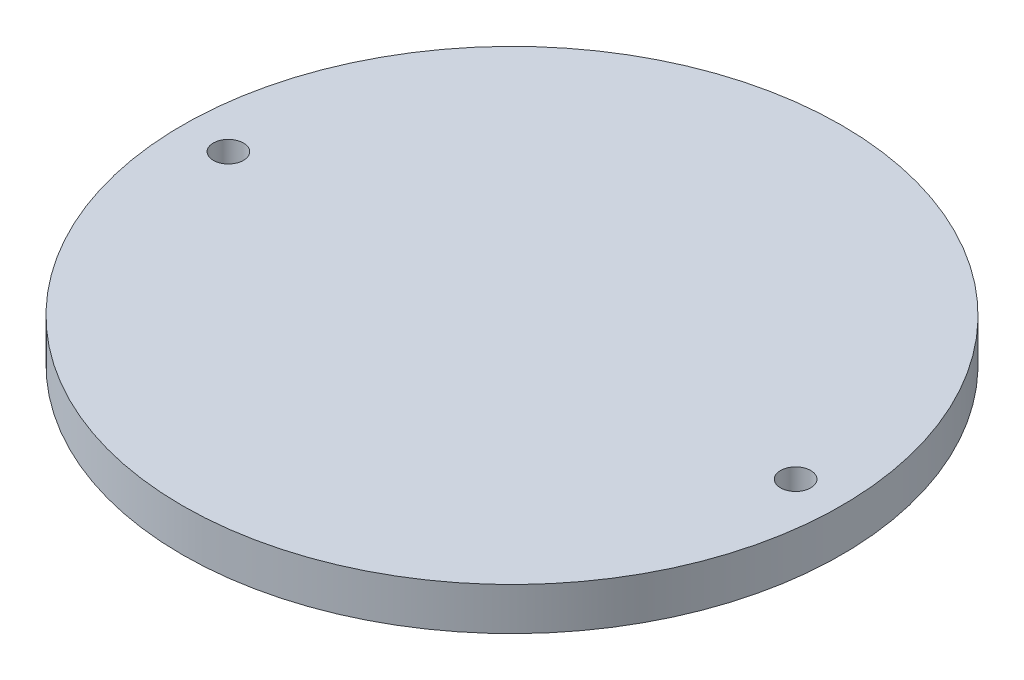
ISO-10303-21;
HEADER;
FILE_DESCRIPTION(('STEP AP214'),'2;1');
FILE_NAME('part.step','',(''),(''),'','','');
FILE_SCHEMA(('AUTOMOTIVE_DESIGN { 1 0 10303 214 1 1 1 1 }'));
ENDSEC;
DATA;
#1=APPLICATION_CONTEXT('core data for automotive mechanical design processes');
#2=APPLICATION_PROTOCOL_DEFINITION('international standard','automotive_design',2000,#1);
#3=PRODUCT_CONTEXT('',#1,'mechanical');
#4=PRODUCT('Part','Part','',(#3));
#5=PRODUCT_RELATED_PRODUCT_CATEGORY('part','',(#4));
#6=PRODUCT_DEFINITION_FORMATION('','',#4);
#7=PRODUCT_DEFINITION_CONTEXT('part definition',#1,'design');
#8=PRODUCT_DEFINITION('design','',#6,#7);
#9=PRODUCT_DEFINITION_SHAPE('','',#8);
#10=(LENGTH_UNIT() NAMED_UNIT(*) SI_UNIT(.MILLI.,.METRE.));
#11=(NAMED_UNIT(*) PLANE_ANGLE_UNIT() SI_UNIT($,.RADIAN.));
#12=(NAMED_UNIT(*) SI_UNIT($,.STERADIAN.) SOLID_ANGLE_UNIT());
#13=UNCERTAINTY_MEASURE_WITH_UNIT(LENGTH_MEASURE(1.E-05),#10,'distance_accuracy_value','');
#14=(GEOMETRIC_REPRESENTATION_CONTEXT(3) GLOBAL_UNCERTAINTY_ASSIGNED_CONTEXT((#13)) GLOBAL_UNIT_ASSIGNED_CONTEXT((#10,
#11,#12)) REPRESENTATION_CONTEXT('',''));
#15=CARTESIAN_POINT('',(0.,0.,0.));
#16=DIRECTION('',(0.,0.,1.));
#17=DIRECTION('',(1.,0.,0.));
#18=AXIS2_PLACEMENT_3D('',#15,#16,#17);
#19=CARTESIAN_POINT('',(0.,9.525,0.));
#20=DIRECTION('',(0.,-1.,0.));
#21=DIRECTION('',(0.,0.,-1.));
#22=AXIS2_PLACEMENT_3D('',#19,#20,#21);
#23=CYLINDRICAL_SURFACE('',#22,73.787);
#24=CARTESIAN_POINT('',(0.,9.525,0.));
#25=DIRECTION('',(0.,1.,0.));
#26=DIRECTION('',(0.,0.,1.));
#27=AXIS2_PLACEMENT_3D('',#24,#25,#26);
#28=CIRCLE('',#27,73.787);
#29=CARTESIAN_POINT('',(0.,9.525,-73.787));
#30=VERTEX_POINT('',#29);
#31=EDGE_CURVE('E10',#30,#30,#28,.T.);
#32=CARTESIAN_POINT('',(0.,0.,0.));
#33=DIRECTION('',(0.,1.,0.));
#34=DIRECTION('',(0.,0.,1.));
#35=AXIS2_PLACEMENT_3D('',#32,#33,#34);
#36=CIRCLE('',#35,73.787);
#37=CARTESIAN_POINT('',(0.,0.,-73.787));
#38=VERTEX_POINT('',#37);
#39=EDGE_CURVE('E46',#38,#38,#36,.T.);
#40=CARTESIAN_POINT('',(0.,9.525,-73.787));
#41=CARTESIAN_POINT('',(0.,9.42578125,-73.787));
#42=CARTESIAN_POINT('',(0.,9.3265625,-73.787));
#43=CARTESIAN_POINT('',(0.,9.128125,-73.787));
#44=CARTESIAN_POINT('',(0.,9.02890625,-73.787));
#45=CARTESIAN_POINT('',(0.,8.83046875,-73.787));
#46=CARTESIAN_POINT('',(0.,8.73125,-73.787));
#47=CARTESIAN_POINT('',(0.,8.5328125,-73.787));
#48=CARTESIAN_POINT('',(0.,8.43359375,-73.787));
#49=CARTESIAN_POINT('',(0.,8.23515625,-73.787));
#50=CARTESIAN_POINT('',(0.,8.1359375,-73.787));
#51=CARTESIAN_POINT('',(0.,7.9375,-73.787));
#52=CARTESIAN_POINT('',(0.,7.83828125,-73.787));
#53=CARTESIAN_POINT('',(0.,7.63984375,-73.787));
#54=CARTESIAN_POINT('',(0.,7.540625,-73.787));
#55=CARTESIAN_POINT('',(0.,7.3421875,-73.787));
#56=CARTESIAN_POINT('',(0.,7.24296875,-73.787));
#57=CARTESIAN_POINT('',(0.,7.04453125,-73.787));
#58=CARTESIAN_POINT('',(0.,6.9453125,-73.787));
#59=CARTESIAN_POINT('',(0.,6.746875,-73.787));
#60=CARTESIAN_POINT('',(0.,6.64765625,-73.787));
#61=CARTESIAN_POINT('',(0.,6.44921875,-73.787));
#62=CARTESIAN_POINT('',(0.,6.35,-73.787));
#63=CARTESIAN_POINT('',(0.,6.1515625,-73.787));
#64=CARTESIAN_POINT('',(0.,6.05234375,-73.787));
#65=CARTESIAN_POINT('',(0.,5.85390625,-73.787));
#66=CARTESIAN_POINT('',(0.,5.7546875,-73.787));
#67=CARTESIAN_POINT('',(0.,5.55625,-73.787));
#68=CARTESIAN_POINT('',(0.,5.45703125,-73.787));
#69=CARTESIAN_POINT('',(0.,5.25859375,-73.787));
#70=CARTESIAN_POINT('',(0.,5.159375,-73.787));
#71=CARTESIAN_POINT('',(0.,4.9609375,-73.787));
#72=CARTESIAN_POINT('',(0.,4.86171875,-73.787));
#73=CARTESIAN_POINT('',(0.,4.66328125,-73.787));
#74=CARTESIAN_POINT('',(0.,4.5640625,-73.787));
#75=CARTESIAN_POINT('',(0.,4.365625,-73.787));
#76=CARTESIAN_POINT('',(0.,4.26640625,-73.787));
#77=CARTESIAN_POINT('',(0.,4.06796875,-73.787));
#78=CARTESIAN_POINT('',(0.,3.96875,-73.787));
#79=CARTESIAN_POINT('',(0.,3.7703125,-73.787));
#80=CARTESIAN_POINT('',(0.,3.67109375,-73.787));
#81=CARTESIAN_POINT('',(0.,3.47265625,-73.787));
#82=CARTESIAN_POINT('',(0.,3.3734375,-73.787));
#83=CARTESIAN_POINT('',(0.,3.175,-73.787));
#84=CARTESIAN_POINT('',(0.,3.07578125,-73.787));
#85=CARTESIAN_POINT('',(0.,2.87734375,-73.787));
#86=CARTESIAN_POINT('',(0.,2.778125,-73.787));
#87=CARTESIAN_POINT('',(0.,2.5796875,-73.787));
#88=CARTESIAN_POINT('',(0.,2.48046875,-73.787));
#89=CARTESIAN_POINT('',(0.,2.28203125,-73.787));
#90=CARTESIAN_POINT('',(0.,2.1828125,-73.787));
#91=CARTESIAN_POINT('',(0.,1.984375,-73.787));
#92=CARTESIAN_POINT('',(0.,1.88515625,-73.787));
#93=CARTESIAN_POINT('',(0.,1.68671875,-73.787));
#94=CARTESIAN_POINT('',(0.,1.5875,-73.787));
#95=CARTESIAN_POINT('',(0.,1.3890625,-73.787));
#96=CARTESIAN_POINT('',(0.,1.28984375,-73.787));
#97=CARTESIAN_POINT('',(0.,1.09140625,-73.787));
#98=CARTESIAN_POINT('',(0.,0.992187500000001,-73.787));
#99=CARTESIAN_POINT('',(0.,0.793750000000001,-73.787));
#100=CARTESIAN_POINT('',(0.,0.69453125,-73.787));
#101=CARTESIAN_POINT('',(0.,0.49609375,-73.787));
#102=CARTESIAN_POINT('',(0.,0.396875,-73.787));
#103=CARTESIAN_POINT('',(0.,0.1984375,-73.787));
#104=CARTESIAN_POINT('',(0.,0.0992187500000001,-73.787));
#105=CARTESIAN_POINT('',(0.,0.,-73.787));
#106=B_SPLINE_CURVE_WITH_KNOTS('',3,(#40,#41,#42,#43,#44,#45,#46,#47,#48,#49,#50,#51,#52,#53,
#54,#55,#56,#57,#58,#59,#60,#61,#62,#63,#64,#65,#66,#67,#68,#69,#70,#71,#72,#73,#74,#75,#76,#77,
#78,#79,#80,#81,#82,#83,#84,#85,#86,#87,#88,#89,#90,#91,#92,#93,#94,#95,#96,#97,#98,#99,#100,
#101,#102,#103,#104,#105),.UNSPECIFIED.,.F.,.F.,(4,2,2,2,2,2,2,2,2,2,2,2,2,2,2,2,2,2,2,2,2,2,2,
2,2,2,2,2,2,2,2,2,4),(0.,0.29765625,0.5953125,0.892968750000001,1.190625,1.48828125,1.7859375,
2.08359375,2.38125,2.67890625,2.9765625,3.27421875,3.571875,3.86953125,4.1671875,4.46484375,
4.7625,5.06015625,5.3578125,5.65546875,5.953125,6.25078125,6.5484375,6.84609375,7.14375,
7.44140625,7.7390625,8.03671875,8.334375,8.63203125,8.9296875,9.22734375,9.525),.UNSPECIFIED.);
#107=EDGE_CURVE('BSEAM43',#30,#38,#106,.T.);
#108=ORIENTED_EDGE('',*,*,#31,.F.);
#109=ORIENTED_EDGE('',*,*,#39,.T.);
#110=ORIENTED_EDGE('',*,*,#107,.T.);
#111=ORIENTED_EDGE('',*,*,#107,.F.);
#112=EDGE_LOOP('',(#108,#110,#109,#111));
#113=FACE_BOUND('',#112,.T.);
#114=ADVANCED_FACE('F43',(#113),#23,.T.);
#115=CARTESIAN_POINT('',(0.,9.525,0.));
#116=DIRECTION('',(0.,1.,0.));
#117=DIRECTION('',(0.,0.,1.));
#118=AXIS2_PLACEMENT_3D('',#115,#116,#117);
#119=PLANE('',#118);
#120=CARTESIAN_POINT('',(-63.5,9.525,0.));
#121=DIRECTION('',(0.,1.,0.));
#122=DIRECTION('',(0.,0.,1.));
#123=AXIS2_PLACEMENT_3D('',#120,#121,#122);
#124=CIRCLE('',#123,3.3782);
#125=CARTESIAN_POINT('',(-63.5,9.525,3.3782));
#126=VERTEX_POINT('',#125);
#127=EDGE_CURVE('E61',#126,#126,#124,.T.);
#128=ORIENTED_EDGE('',*,*,#127,.F.);
#129=EDGE_LOOP('',(#128));
#130=FACE_BOUND('',#129,.T.);
#131=CARTESIAN_POINT('',(63.5,9.525,0.));
#132=DIRECTION('',(0.,1.,0.));
#133=DIRECTION('',(0.,0.,1.));
#134=AXIS2_PLACEMENT_3D('',#131,#132,#133);
#135=CIRCLE('',#134,3.37819999999999);
#136=CARTESIAN_POINT('',(63.5,9.525,3.37819999999997));
#137=VERTEX_POINT('',#136);
#138=EDGE_CURVE('E58',#137,#137,#135,.T.);
#139=ORIENTED_EDGE('',*,*,#138,.F.);
#140=EDGE_LOOP('',(#139));
#141=FACE_BOUND('',#140,.T.);
#142=ORIENTED_EDGE('',*,*,#31,.T.);
#143=EDGE_LOOP('',(#142));
#144=FACE_BOUND('',#143,.T.);
#145=ADVANCED_FACE('F77',(#130,#141,#144),#119,.T.);
#146=CARTESIAN_POINT('',(0.,0.,0.));
#147=DIRECTION('',(0.,1.,0.));
#148=DIRECTION('',(0.,0.,1.));
#149=AXIS2_PLACEMENT_3D('',#146,#147,#148);
#150=PLANE('',#149);
#151=CARTESIAN_POINT('',(-63.5,0.,0.));
#152=DIRECTION('',(0.,1.,0.));
#153=DIRECTION('',(0.,0.,1.));
#154=AXIS2_PLACEMENT_3D('',#151,#152,#153);
#155=CIRCLE('',#154,3.3782);
#156=CARTESIAN_POINT('',(-63.5,0.,3.3782));
#157=VERTEX_POINT('',#156);
#158=EDGE_CURVE('E53',#157,#157,#155,.T.);
#159=ORIENTED_EDGE('',*,*,#158,.T.);
#160=EDGE_LOOP('',(#159));
#161=FACE_BOUND('',#160,.T.);
#162=CARTESIAN_POINT('',(63.5,0.,0.));
#163=DIRECTION('',(0.,1.,0.));
#164=DIRECTION('',(0.,0.,1.));
#165=AXIS2_PLACEMENT_3D('',#162,#163,#164);
#166=CIRCLE('',#165,3.37819999999999);
#167=CARTESIAN_POINT('',(63.5,0.,3.37819999999997));
#168=VERTEX_POINT('',#167);
#169=EDGE_CURVE('E55',#168,#168,#166,.T.);
#170=ORIENTED_EDGE('',*,*,#169,.T.);
#171=EDGE_LOOP('',(#170));
#172=FACE_BOUND('',#171,.T.);
#173=ORIENTED_EDGE('',*,*,#39,.F.);
#174=EDGE_LOOP('',(#173));
#175=FACE_BOUND('',#174,.T.);
#176=ADVANCED_FACE('F67',(#161,#172,#175),#150,.F.);
#177=CARTESIAN_POINT('',(63.5,0.,0.));
#178=DIRECTION('',(0.,1.,0.));
#179=DIRECTION('',(0.,0.,1.));
#180=AXIS2_PLACEMENT_3D('',#177,#178,#179);
#181=CYLINDRICAL_SURFACE('',#180,3.37819999999999);
#182=CARTESIAN_POINT('',(63.5,0.,3.37819999999997));
#183=CARTESIAN_POINT('',(63.5,0.0992187499999999,3.37819999999997));
#184=CARTESIAN_POINT('',(63.5,0.1984375,3.37819999999997));
#185=CARTESIAN_POINT('',(63.5,0.396875,3.37819999999997));
#186=CARTESIAN_POINT('',(63.5,0.49609375,3.37819999999997));
#187=CARTESIAN_POINT('',(63.5,0.69453125,3.37819999999997));
#188=CARTESIAN_POINT('',(63.5,0.79375,3.37819999999997));
#189=CARTESIAN_POINT('',(63.5,0.9921875,3.37819999999997));
#190=CARTESIAN_POINT('',(63.5,1.09140625,3.37819999999997));
#191=CARTESIAN_POINT('',(63.5,1.28984375,3.37819999999997));
#192=CARTESIAN_POINT('',(63.5,1.3890625,3.37819999999997));
#193=CARTESIAN_POINT('',(63.5,1.5875,3.37819999999997));
#194=CARTESIAN_POINT('',(63.5,1.68671875,3.37819999999997));
#195=CARTESIAN_POINT('',(63.5,1.88515625,3.37819999999997));
#196=CARTESIAN_POINT('',(63.5,1.984375,3.37819999999997));
#197=CARTESIAN_POINT('',(63.5,2.1828125,3.37819999999997));
#198=CARTESIAN_POINT('',(63.5,2.28203125,3.37819999999997));
#199=CARTESIAN_POINT('',(63.5,2.48046875,3.37819999999997));
#200=CARTESIAN_POINT('',(63.5,2.5796875,3.37819999999997));
#201=CARTESIAN_POINT('',(63.5,2.778125,3.37819999999997));
#202=CARTESIAN_POINT('',(63.5,2.87734375,3.37819999999997));
#203=CARTESIAN_POINT('',(63.5,3.07578125,3.37819999999997));
#204=CARTESIAN_POINT('',(63.5,3.175,3.37819999999997));
#205=CARTESIAN_POINT('',(63.5,3.3734375,3.37819999999997));
#206=CARTESIAN_POINT('',(63.5,3.47265625,3.37819999999997));
#207=CARTESIAN_POINT('',(63.5,3.67109375,3.37819999999997));
#208=CARTESIAN_POINT('',(63.5,3.7703125,3.37819999999997));
#209=CARTESIAN_POINT('',(63.5,3.96875,3.37819999999997));
#210=CARTESIAN_POINT('',(63.5,4.06796875,3.37819999999997));
#211=CARTESIAN_POINT('',(63.5,4.26640625,3.37819999999997));
#212=CARTESIAN_POINT('',(63.5,4.365625,3.37819999999997));
#213=CARTESIAN_POINT('',(63.5,4.5640625,3.37819999999997));
#214=CARTESIAN_POINT('',(63.5,4.66328125,3.37819999999997));
#215=CARTESIAN_POINT('',(63.5,4.86171875,3.37819999999997));
#216=CARTESIAN_POINT('',(63.5,4.9609375,3.37819999999997));
#217=CARTESIAN_POINT('',(63.5,5.159375,3.37819999999997));
#218=CARTESIAN_POINT('',(63.5,5.25859375,3.37819999999997));
#219=CARTESIAN_POINT('',(63.5,5.45703125,3.37819999999997));
#220=CARTESIAN_POINT('',(63.5,5.55625,3.37819999999997));
#221=CARTESIAN_POINT('',(63.5,5.7546875,3.37819999999997));
#222=CARTESIAN_POINT('',(63.5,5.85390625,3.37819999999997));
#223=CARTESIAN_POINT('',(63.5,6.05234375,3.37819999999997));
#224=CARTESIAN_POINT('',(63.5,6.1515625,3.37819999999997));
#225=CARTESIAN_POINT('',(63.5,6.35,3.37819999999997));
#226=CARTESIAN_POINT('',(63.5,6.44921875,3.37819999999997));
#227=CARTESIAN_POINT('',(63.5,6.64765625,3.37819999999997));
#228=CARTESIAN_POINT('',(63.5,6.746875,3.37819999999997));
#229=CARTESIAN_POINT('',(63.5,6.9453125,3.37819999999997));
#230=CARTESIAN_POINT('',(63.5,7.04453125,3.37819999999997));
#231=CARTESIAN_POINT('',(63.5,7.24296875,3.37819999999997));
#232=CARTESIAN_POINT('',(63.5,7.3421875,3.37819999999997));
#233=CARTESIAN_POINT('',(63.5,7.540625,3.37819999999997));
#234=CARTESIAN_POINT('',(63.5,7.63984375,3.37819999999997));
#235=CARTESIAN_POINT('',(63.5,7.83828125,3.37819999999997));
#236=CARTESIAN_POINT('',(63.5,7.9375,3.37819999999997));
#237=CARTESIAN_POINT('',(63.5,8.1359375,3.37819999999997));
#238=CARTESIAN_POINT('',(63.5,8.23515625,3.37819999999997));
#239=CARTESIAN_POINT('',(63.5,8.43359375,3.37819999999997));
#240=CARTESIAN_POINT('',(63.5,8.5328125,3.37819999999997));
#241=CARTESIAN_POINT('',(63.5,8.73125,3.37819999999997));
#242=CARTESIAN_POINT('',(63.5,8.83046875,3.37819999999997));
#243=CARTESIAN_POINT('',(63.5,9.02890625,3.37819999999997));
#244=CARTESIAN_POINT('',(63.5,9.128125,3.37819999999997));
#245=CARTESIAN_POINT('',(63.5,9.3265625,3.37819999999997));
#246=CARTESIAN_POINT('',(63.5,9.42578125,3.37819999999997));
#247=CARTESIAN_POINT('',(63.5,9.525,3.37819999999997));
#248=B_SPLINE_CURVE_WITH_KNOTS('',3,(#182,#183,#184,#185,#186,#187,#188,#189,#190,#191,#192,
#193,#194,#195,#196,#197,#198,#199,#200,#201,#202,#203,#204,#205,#206,#207,#208,#209,#210,#211,
#212,#213,#214,#215,#216,#217,#218,#219,#220,#221,#222,#223,#224,#225,#226,#227,#228,#229,#230,
#231,#232,#233,#234,#235,#236,#237,#238,#239,#240,#241,#242,#243,#244,#245,#246,#247),
.UNSPECIFIED.,.F.,.F.,(4,2,2,2,2,2,2,2,2,2,2,2,2,2,2,2,2,2,2,2,2,2,2,2,2,2,2,2,2,2,2,2,4),(0.,
0.29765625,0.5953125,0.89296875,1.190625,1.48828125,1.7859375,2.08359375,2.38125,2.67890625,
2.9765625,3.27421875,3.571875,3.86953125,4.1671875,4.46484375,4.7625,5.06015625,5.3578125,
5.65546875,5.953125,6.25078125,6.5484375,6.84609375,7.14375,7.44140625,7.7390625,8.03671875,
8.334375,8.63203125,8.9296875,9.22734375,9.525),.UNSPECIFIED.);
#249=EDGE_CURVE('BSEAM73',#168,#137,#248,.T.);
#250=ORIENTED_EDGE('',*,*,#169,.F.);
#251=ORIENTED_EDGE('',*,*,#138,.T.);
#252=ORIENTED_EDGE('',*,*,#249,.T.);
#253=ORIENTED_EDGE('',*,*,#249,.F.);
#254=EDGE_LOOP('',(#250,#252,#251,#253));
#255=FACE_BOUND('',#254,.T.);
#256=ADVANCED_FACE('F73',(#255),#181,.F.);
#257=CARTESIAN_POINT('',(-63.5,0.,0.));
#258=DIRECTION('',(0.,1.,0.));
#259=DIRECTION('',(0.,0.,1.));
#260=AXIS2_PLACEMENT_3D('',#257,#258,#259);
#261=CYLINDRICAL_SURFACE('',#260,3.3782);
#262=CARTESIAN_POINT('',(-63.5,0.,3.3782));
#263=CARTESIAN_POINT('',(-63.5,0.0992187499999999,3.3782));
#264=CARTESIAN_POINT('',(-63.5,0.1984375,3.3782));
#265=CARTESIAN_POINT('',(-63.5,0.396875,3.3782));
#266=CARTESIAN_POINT('',(-63.5,0.49609375,3.3782));
#267=CARTESIAN_POINT('',(-63.5,0.69453125,3.3782));
#268=CARTESIAN_POINT('',(-63.5,0.79375,3.3782));
#269=CARTESIAN_POINT('',(-63.5,0.9921875,3.3782));
#270=CARTESIAN_POINT('',(-63.5,1.09140625,3.3782));
#271=CARTESIAN_POINT('',(-63.5,1.28984375,3.3782));
#272=CARTESIAN_POINT('',(-63.5,1.3890625,3.3782));
#273=CARTESIAN_POINT('',(-63.5,1.5875,3.3782));
#274=CARTESIAN_POINT('',(-63.5,1.68671875,3.3782));
#275=CARTESIAN_POINT('',(-63.5,1.88515625,3.3782));
#276=CARTESIAN_POINT('',(-63.5,1.984375,3.3782));
#277=CARTESIAN_POINT('',(-63.5,2.1828125,3.3782));
#278=CARTESIAN_POINT('',(-63.5,2.28203125,3.3782));
#279=CARTESIAN_POINT('',(-63.5,2.48046875,3.3782));
#280=CARTESIAN_POINT('',(-63.5,2.5796875,3.3782));
#281=CARTESIAN_POINT('',(-63.5,2.778125,3.3782));
#282=CARTESIAN_POINT('',(-63.5,2.87734375,3.3782));
#283=CARTESIAN_POINT('',(-63.5,3.07578125,3.3782));
#284=CARTESIAN_POINT('',(-63.5,3.175,3.3782));
#285=CARTESIAN_POINT('',(-63.5,3.3734375,3.3782));
#286=CARTESIAN_POINT('',(-63.5,3.47265625,3.3782));
#287=CARTESIAN_POINT('',(-63.5,3.67109375,3.3782));
#288=CARTESIAN_POINT('',(-63.5,3.7703125,3.3782));
#289=CARTESIAN_POINT('',(-63.5,3.96875,3.3782));
#290=CARTESIAN_POINT('',(-63.5,4.06796875,3.3782));
#291=CARTESIAN_POINT('',(-63.5,4.26640625,3.3782));
#292=CARTESIAN_POINT('',(-63.5,4.365625,3.3782));
#293=CARTESIAN_POINT('',(-63.5,4.5640625,3.3782));
#294=CARTESIAN_POINT('',(-63.5,4.66328125,3.3782));
#295=CARTESIAN_POINT('',(-63.5,4.86171875,3.3782));
#296=CARTESIAN_POINT('',(-63.5,4.9609375,3.3782));
#297=CARTESIAN_POINT('',(-63.5,5.159375,3.3782));
#298=CARTESIAN_POINT('',(-63.5,5.25859375,3.3782));
#299=CARTESIAN_POINT('',(-63.5,5.45703125,3.3782));
#300=CARTESIAN_POINT('',(-63.5,5.55625,3.3782));
#301=CARTESIAN_POINT('',(-63.5,5.7546875,3.3782));
#302=CARTESIAN_POINT('',(-63.5,5.85390625,3.3782));
#303=CARTESIAN_POINT('',(-63.5,6.05234375,3.3782));
#304=CARTESIAN_POINT('',(-63.5,6.1515625,3.3782));
#305=CARTESIAN_POINT('',(-63.5,6.35,3.3782));
#306=CARTESIAN_POINT('',(-63.5,6.44921875,3.3782));
#307=CARTESIAN_POINT('',(-63.5,6.64765625,3.3782));
#308=CARTESIAN_POINT('',(-63.5,6.746875,3.3782));
#309=CARTESIAN_POINT('',(-63.5,6.9453125,3.3782));
#310=CARTESIAN_POINT('',(-63.5,7.04453125,3.3782));
#311=CARTESIAN_POINT('',(-63.5,7.24296875,3.3782));
#312=CARTESIAN_POINT('',(-63.5,7.3421875,3.3782));
#313=CARTESIAN_POINT('',(-63.5,7.540625,3.3782));
#314=CARTESIAN_POINT('',(-63.5,7.63984375,3.3782));
#315=CARTESIAN_POINT('',(-63.5,7.83828125,3.3782));
#316=CARTESIAN_POINT('',(-63.5,7.9375,3.3782));
#317=CARTESIAN_POINT('',(-63.5,8.1359375,3.3782));
#318=CARTESIAN_POINT('',(-63.5,8.23515625,3.3782));
#319=CARTESIAN_POINT('',(-63.5,8.43359375,3.3782));
#320=CARTESIAN_POINT('',(-63.5,8.5328125,3.3782));
#321=CARTESIAN_POINT('',(-63.5,8.73125,3.3782));
#322=CARTESIAN_POINT('',(-63.5,8.83046875,3.3782));
#323=CARTESIAN_POINT('',(-63.5,9.02890625,3.3782));
#324=CARTESIAN_POINT('',(-63.5,9.128125,3.3782));
#325=CARTESIAN_POINT('',(-63.5,9.3265625,3.3782));
#326=CARTESIAN_POINT('',(-63.5,9.42578125,3.3782));
#327=CARTESIAN_POINT('',(-63.5,9.525,3.3782));
#328=B_SPLINE_CURVE_WITH_KNOTS('',3,(#262,#263,#264,#265,#266,#267,#268,#269,#270,#271,#272,
#273,#274,#275,#276,#277,#278,#279,#280,#281,#282,#283,#284,#285,#286,#287,#288,#289,#290,#291,
#292,#293,#294,#295,#296,#297,#298,#299,#300,#301,#302,#303,#304,#305,#306,#307,#308,#309,#310,
#311,#312,#313,#314,#315,#316,#317,#318,#319,#320,#321,#322,#323,#324,#325,#326,#327),
.UNSPECIFIED.,.F.,.F.,(4,2,2,2,2,2,2,2,2,2,2,2,2,2,2,2,2,2,2,2,2,2,2,2,2,2,2,2,2,2,2,2,4),(0.,
0.29765625,0.5953125,0.89296875,1.190625,1.48828125,1.7859375,2.08359375,2.38125,2.67890625,
2.9765625,3.27421875,3.571875,3.86953125,4.1671875,4.46484375,4.7625,5.06015625,5.3578125,
5.65546875,5.953125,6.25078125,6.5484375,6.84609375,7.14375,7.44140625,7.7390625,8.03671875,
8.334375,8.63203125,8.9296875,9.22734375,9.525),.UNSPECIFIED.);
#329=EDGE_CURVE('BSEAM70',#157,#126,#328,.T.);
#330=ORIENTED_EDGE('',*,*,#158,.F.);
#331=ORIENTED_EDGE('',*,*,#127,.T.);
#332=ORIENTED_EDGE('',*,*,#329,.T.);
#333=ORIENTED_EDGE('',*,*,#329,.F.);
#334=EDGE_LOOP('',(#330,#332,#331,#333));
#335=FACE_BOUND('',#334,.T.);
#336=ADVANCED_FACE('F70',(#335),#261,.F.);
#337=CLOSED_SHELL('',(#114,#145,#176,#256,#336));
#338=MANIFOLD_SOLID_BREP('B2',#337);
#339=ADVANCED_BREP_SHAPE_REPRESENTATION('',(#18,#338),#14);
#340=SHAPE_DEFINITION_REPRESENTATION(#9,#339);
ENDSEC;
END-ISO-10303-21;
